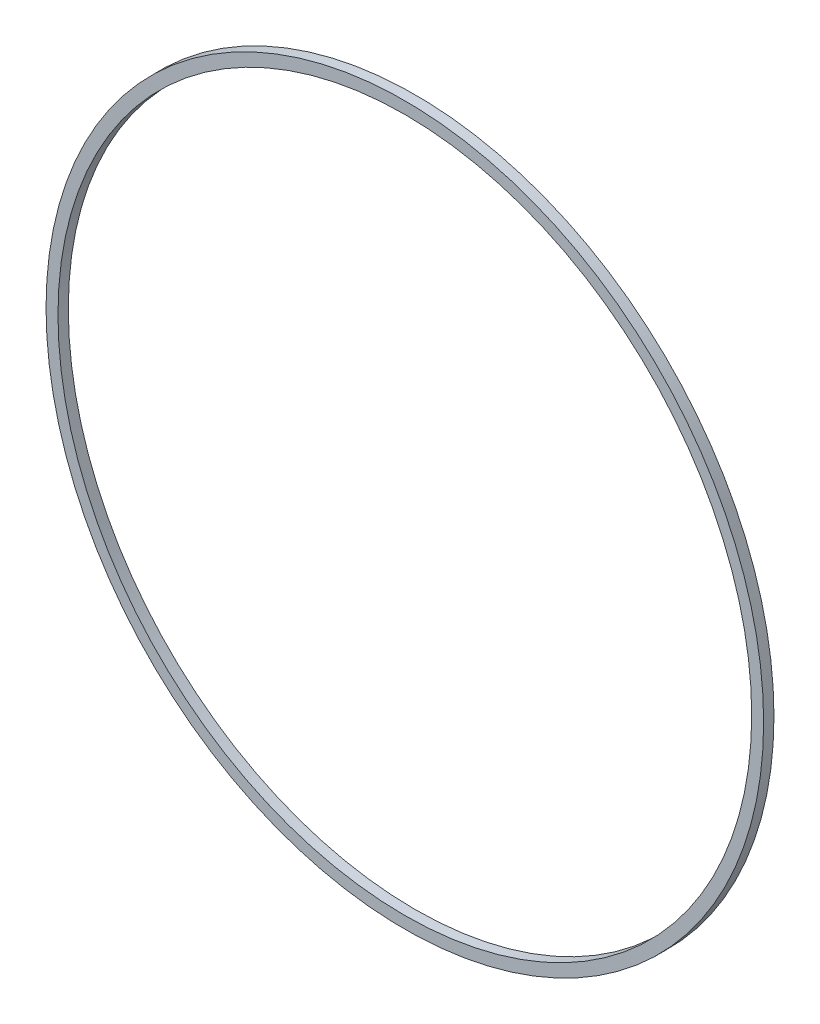
ISO-10303-21;
HEADER;
FILE_DESCRIPTION(('STEP AP214'),'2;1');
FILE_NAME('part.step','',(''),(''),'','','');
FILE_SCHEMA(('AUTOMOTIVE_DESIGN { 1 0 10303 214 1 1 1 1 }'));
ENDSEC;
DATA;
#1=APPLICATION_CONTEXT('core data for automotive mechanical design processes');
#2=APPLICATION_PROTOCOL_DEFINITION('international standard','automotive_design',2000,#1);
#3=PRODUCT_CONTEXT('',#1,'mechanical');
#4=PRODUCT('Part','Part','',(#3));
#5=PRODUCT_RELATED_PRODUCT_CATEGORY('part','',(#4));
#6=PRODUCT_DEFINITION_FORMATION('','',#4);
#7=PRODUCT_DEFINITION_CONTEXT('part definition',#1,'design');
#8=PRODUCT_DEFINITION('design','',#6,#7);
#9=PRODUCT_DEFINITION_SHAPE('','',#8);
#10=(LENGTH_UNIT() NAMED_UNIT(*) SI_UNIT(.MILLI.,.METRE.));
#11=(NAMED_UNIT(*) PLANE_ANGLE_UNIT() SI_UNIT($,.RADIAN.));
#12=(NAMED_UNIT(*) SI_UNIT($,.STERADIAN.) SOLID_ANGLE_UNIT());
#13=UNCERTAINTY_MEASURE_WITH_UNIT(LENGTH_MEASURE(1.E-05),#10,'distance_accuracy_value','');
#14=(GEOMETRIC_REPRESENTATION_CONTEXT(3) GLOBAL_UNCERTAINTY_ASSIGNED_CONTEXT((#13)) GLOBAL_UNIT_ASSIGNED_CONTEXT((#10,
#11,#12)) REPRESENTATION_CONTEXT('',''));
#15=CARTESIAN_POINT('',(0.,0.,0.));
#16=DIRECTION('',(0.,0.,1.));
#17=DIRECTION('',(1.,0.,0.));
#18=AXIS2_PLACEMENT_3D('',#15,#16,#17);
#19=CARTESIAN_POINT('',(0.,0.,1.27));
#20=DIRECTION('',(0.,0.,-1.));
#21=DIRECTION('',(-1.,0.,0.));
#22=AXIS2_PLACEMENT_3D('',#19,#20,#21);
#23=CYLINDRICAL_SURFACE('',#22,44.1325);
#24=CARTESIAN_POINT('',(0.,0.,1.27));
#25=DIRECTION('',(0.,0.,1.));
#26=DIRECTION('',(1.,0.,0.));
#27=AXIS2_PLACEMENT_3D('',#24,#25,#26);
#28=CIRCLE('',#27,44.1325);
#29=CARTESIAN_POINT('',(44.1325,0.,1.27));
#30=VERTEX_POINT('',#29);
#31=EDGE_CURVE('E10',#30,#30,#28,.T.);
#32=ORIENTED_EDGE('',*,*,#31,.F.);
#33=EDGE_LOOP('',(#32));
#34=FACE_BOUND('',#33,.T.);
#35=CARTESIAN_POINT('',(0.,0.,0.));
#36=DIRECTION('',(0.,0.,1.));
#37=DIRECTION('',(1.,0.,0.));
#38=AXIS2_PLACEMENT_3D('',#35,#36,#37);
#39=CIRCLE('',#38,44.1325);
#40=CARTESIAN_POINT('',(44.1325,0.,0.));
#41=VERTEX_POINT('',#40);
#42=EDGE_CURVE('E34',#41,#41,#39,.T.);
#43=ORIENTED_EDGE('',*,*,#42,.T.);
#44=EDGE_LOOP('',(#43));
#45=FACE_BOUND('',#44,.T.);
#46=ADVANCED_FACE('F31',(#34,#45),#23,.T.);
#47=CARTESIAN_POINT('',(0.,0.,1.27));
#48=DIRECTION('',(0.,0.,1.));
#49=DIRECTION('',(1.,0.,0.));
#50=AXIS2_PLACEMENT_3D('',#47,#48,#49);
#51=PLANE('',#50);
#52=CARTESIAN_POINT('',(0.,0.,1.27));
#53=DIRECTION('',(0.,0.,1.));
#54=DIRECTION('',(1.,0.,0.));
#55=AXIS2_PLACEMENT_3D('',#52,#53,#54);
#56=CIRCLE('',#55,42.664452200052);
#57=CARTESIAN_POINT('',(42.664452200052,0.,1.27));
#58=VERTEX_POINT('',#57);
#59=EDGE_CURVE('E43',#58,#58,#56,.T.);
#60=ORIENTED_EDGE('',*,*,#59,.F.);
#61=EDGE_LOOP('',(#60));
#62=FACE_BOUND('',#61,.T.);
#63=ORIENTED_EDGE('',*,*,#31,.T.);
#64=EDGE_LOOP('',(#63));
#65=FACE_BOUND('',#64,.T.);
#66=ADVANCED_FACE('F58',(#62,#65),#51,.T.);
#67=CARTESIAN_POINT('',(0.,0.,0.));
#68=DIRECTION('',(0.,0.,1.));
#69=DIRECTION('',(1.,0.,0.));
#70=AXIS2_PLACEMENT_3D('',#67,#68,#69);
#71=PLANE('',#70);
#72=CARTESIAN_POINT('',(0.,0.,0.));
#73=DIRECTION('',(0.,0.,1.));
#74=DIRECTION('',(1.,0.,0.));
#75=AXIS2_PLACEMENT_3D('',#72,#73,#74);
#76=CIRCLE('',#75,42.664452200052);
#77=CARTESIAN_POINT('',(42.664452200052,0.,0.));
#78=VERTEX_POINT('',#77);
#79=EDGE_CURVE('E41',#78,#78,#76,.T.);
#80=ORIENTED_EDGE('',*,*,#79,.T.);
#81=EDGE_LOOP('',(#80));
#82=FACE_BOUND('',#81,.T.);
#83=ORIENTED_EDGE('',*,*,#42,.F.);
#84=EDGE_LOOP('',(#83));
#85=FACE_BOUND('',#84,.T.);
#86=ADVANCED_FACE('F49',(#82,#85),#71,.F.);
#87=CARTESIAN_POINT('',(0.,0.,0.));
#88=DIRECTION('',(0.,0.,1.));
#89=DIRECTION('',(1.,0.,0.));
#90=AXIS2_PLACEMENT_3D('',#87,#88,#89);
#91=CYLINDRICAL_SURFACE('',#90,42.664452200052);
#92=ORIENTED_EDGE('',*,*,#79,.F.);
#93=EDGE_LOOP('',(#92));
#94=FACE_BOUND('',#93,.T.);
#95=ORIENTED_EDGE('',*,*,#59,.T.);
#96=EDGE_LOOP('',(#95));
#97=FACE_BOUND('',#96,.T.);
#98=ADVANCED_FACE('F52',(#94,#97),#91,.F.);
#99=CLOSED_SHELL('',(#46,#66,#86,#98));
#100=MANIFOLD_SOLID_BREP('B2',#99);
#101=ADVANCED_BREP_SHAPE_REPRESENTATION('',(#18,#100),#14);
#102=SHAPE_DEFINITION_REPRESENTATION(#9,#101);
ENDSEC;
END-ISO-10303-21;
